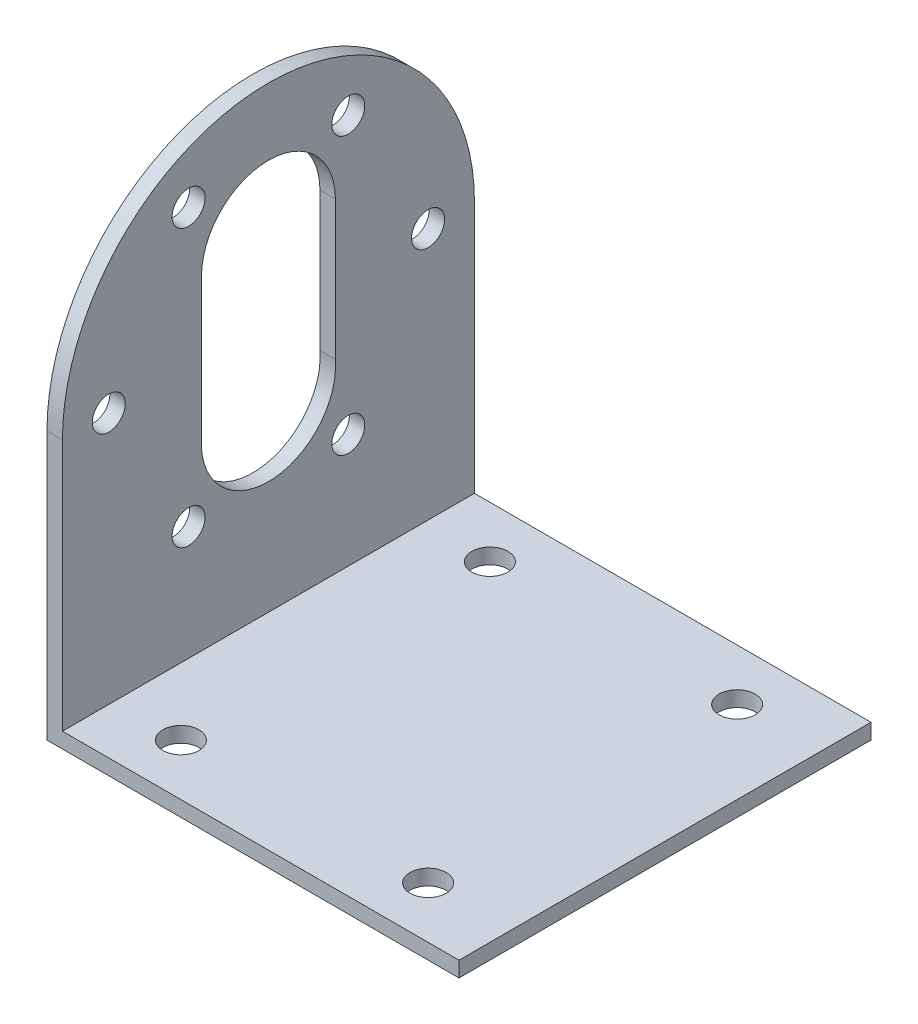
ISO-10303-21;
HEADER;
FILE_DESCRIPTION(('STEP AP214'),'2;1');
FILE_NAME('part.step','',(''),(''),'','','');
FILE_SCHEMA(('AUTOMOTIVE_DESIGN { 1 0 10303 214 1 1 1 1 }'));
ENDSEC;
DATA;
#1=APPLICATION_CONTEXT('core data for automotive mechanical design processes');
#2=APPLICATION_PROTOCOL_DEFINITION('international standard','automotive_design',2000,#1);
#3=PRODUCT_CONTEXT('',#1,'mechanical');
#4=PRODUCT('Part','Part','',(#3));
#5=PRODUCT_RELATED_PRODUCT_CATEGORY('part','',(#4));
#6=PRODUCT_DEFINITION_FORMATION('','',#4);
#7=PRODUCT_DEFINITION_CONTEXT('part definition',#1,'design');
#8=PRODUCT_DEFINITION('design','',#6,#7);
#9=PRODUCT_DEFINITION_SHAPE('','',#8);
#10=(LENGTH_UNIT() NAMED_UNIT(*) SI_UNIT(.MILLI.,.METRE.));
#11=(NAMED_UNIT(*) PLANE_ANGLE_UNIT() SI_UNIT($,.RADIAN.));
#12=(NAMED_UNIT(*) SI_UNIT($,.STERADIAN.) SOLID_ANGLE_UNIT());
#13=UNCERTAINTY_MEASURE_WITH_UNIT(LENGTH_MEASURE(1.E-05),#10,'distance_accuracy_value','');
#14=(GEOMETRIC_REPRESENTATION_CONTEXT(3) GLOBAL_UNCERTAINTY_ASSIGNED_CONTEXT((#13)) GLOBAL_UNIT_ASSIGNED_CONTEXT((#10,
#11,#12)) REPRESENTATION_CONTEXT('',''));
#15=CARTESIAN_POINT('',(0.,0.,0.));
#16=DIRECTION('',(0.,0.,1.));
#17=DIRECTION('',(1.,0.,0.));
#18=AXIS2_PLACEMENT_3D('',#15,#16,#17);
#19=CARTESIAN_POINT('',(20.,1.5,-20.));
#20=DIRECTION('',(-1.,0.,0.));
#21=DIRECTION('',(0.,0.,1.));
#22=AXIS2_PLACEMENT_3D('',#19,#20,#21);
#23=PLANE('',#22);
#24=DIRECTION('',(0.,0.,-1.));
#25=VECTOR('',#24,1.);
#26=CARTESIAN_POINT('',(20.,0.,-20.));
#27=LINE('',#26,#25);
#28=CARTESIAN_POINT('',(20.,0.,20.));
#29=VERTEX_POINT('',#28);
#30=CARTESIAN_POINT('',(20.,0.,-20.));
#31=VERTEX_POINT('',#30);
#32=EDGE_CURVE('E93',#29,#31,#27,.T.);
#33=ORIENTED_EDGE('',*,*,#32,.T.);
#34=DIRECTION('',(0.,-1.,0.));
#35=VECTOR('',#34,1.);
#36=CARTESIAN_POINT('',(20.,1.5,-20.));
#37=LINE('',#36,#35);
#38=CARTESIAN_POINT('',(20.,1.5,-20.));
#39=VERTEX_POINT('',#38);
#40=EDGE_CURVE('E11',#39,#31,#37,.T.);
#41=ORIENTED_EDGE('',*,*,#40,.F.);
#42=DIRECTION('',(0.,0.,-1.));
#43=VECTOR('',#42,1.);
#44=CARTESIAN_POINT('',(20.,1.5,-20.));
#45=LINE('',#44,#43);
#46=CARTESIAN_POINT('',(20.,1.5,20.));
#47=VERTEX_POINT('',#46);
#48=EDGE_CURVE('E87',#47,#39,#45,.T.);
#49=ORIENTED_EDGE('',*,*,#48,.F.);
#50=DIRECTION('',(0.,-1.,0.));
#51=VECTOR('',#50,1.);
#52=CARTESIAN_POINT('',(20.,1.5,20.));
#53=LINE('',#52,#51);
#54=EDGE_CURVE('E79',#47,#29,#53,.T.);
#55=ORIENTED_EDGE('',*,*,#54,.T.);
#56=EDGE_LOOP('',(#33,#41,#49,#55));
#57=FACE_BOUND('',#56,.T.);
#58=ADVANCED_FACE('F37',(#57),#23,.F.);
#59=CARTESIAN_POINT('',(-20.,1.5,-20.));
#60=DIRECTION('',(0.,0.,1.));
#61=DIRECTION('',(1.,0.,0.));
#62=AXIS2_PLACEMENT_3D('',#59,#60,#61);
#63=PLANE('',#62);
#64=DIRECTION('',(-1.,0.,0.));
#65=VECTOR('',#64,1.);
#66=CARTESIAN_POINT('',(-20.,0.,-20.));
#67=LINE('',#66,#65);
#68=CARTESIAN_POINT('',(-20.,0.,-20.));
#69=VERTEX_POINT('',#68);
#70=EDGE_CURVE('E96',#31,#69,#67,.T.);
#71=ORIENTED_EDGE('',*,*,#70,.T.);
#72=DIRECTION('',(0.,-1.,0.));
#73=VECTOR('',#72,1.);
#74=CARTESIAN_POINT('',(-20.,1.5,-20.));
#75=LINE('',#74,#73);
#76=CARTESIAN_POINT('',(-20.,26.,-20.));
#77=VERTEX_POINT('',#76);
#78=EDGE_CURVE('E44',#77,#69,#75,.T.);
#79=ORIENTED_EDGE('',*,*,#78,.F.);
#80=DIRECTION('',(-1.,0.,0.));
#81=VECTOR('',#80,1.);
#82=CARTESIAN_POINT('',(-18.5,26.,-20.));
#83=LINE('',#82,#81);
#84=CARTESIAN_POINT('',(-18.5,26.,-20.));
#85=VERTEX_POINT('',#84);
#86=EDGE_CURVE('E97',#85,#77,#83,.T.);
#87=ORIENTED_EDGE('',*,*,#86,.F.);
#88=DIRECTION('',(0.,-1.,0.));
#89=VECTOR('',#88,1.);
#90=CARTESIAN_POINT('',(-18.5,0.,-20.));
#91=LINE('',#90,#89);
#92=CARTESIAN_POINT('',(-18.5,1.5,-20.));
#93=VERTEX_POINT('',#92);
#94=EDGE_CURVE('E135',#85,#93,#91,.T.);
#95=ORIENTED_EDGE('',*,*,#94,.T.);
#96=DIRECTION('',(-1.,0.,0.));
#97=VECTOR('',#96,1.);
#98=CARTESIAN_POINT('',(-20.,1.5,-20.));
#99=LINE('',#98,#97);
#100=EDGE_CURVE('E190',#39,#93,#99,.T.);
#101=ORIENTED_EDGE('',*,*,#100,.F.);
#102=ORIENTED_EDGE('',*,*,#40,.T.);
#103=EDGE_LOOP('',(#71,#79,#87,#95,#101,#102));
#104=FACE_BOUND('',#103,.T.);
#105=ADVANCED_FACE('F118',(#104),#63,.F.);
#106=CARTESIAN_POINT('',(-20.,1.5,-20.));
#107=DIRECTION('',(1.,0.,0.));
#108=DIRECTION('',(0.,0.,-1.));
#109=AXIS2_PLACEMENT_3D('',#106,#107,#108);
#110=PLANE('',#109);
#111=DIRECTION('',(0.,0.,1.));
#112=VECTOR('',#111,1.);
#113=CARTESIAN_POINT('',(-20.,0.,-20.));
#114=LINE('',#113,#112);
#115=CARTESIAN_POINT('',(-20.,0.,20.));
#116=VERTEX_POINT('',#115);
#117=EDGE_CURVE('E88',#69,#116,#114,.T.);
#118=ORIENTED_EDGE('',*,*,#117,.T.);
#119=DIRECTION('',(0.,-1.,0.));
#120=VECTOR('',#119,1.);
#121=CARTESIAN_POINT('',(-20.,1.5,20.));
#122=LINE('',#121,#120);
#123=CARTESIAN_POINT('',(-20.,26.,20.));
#124=VERTEX_POINT('',#123);
#125=EDGE_CURVE('E83',#124,#116,#122,.T.);
#126=ORIENTED_EDGE('',*,*,#125,.F.);
#127=CARTESIAN_POINT('',(-20.,26.,0.));
#128=DIRECTION('',(-1.,0.,0.));
#129=DIRECTION('',(0.,0.,1.));
#130=AXIS2_PLACEMENT_3D('',#127,#128,#129);
#131=CIRCLE('',#130,20.);
#132=EDGE_CURVE('E115',#124,#77,#131,.T.);
#133=ORIENTED_EDGE('',*,*,#132,.T.);
#134=ORIENTED_EDGE('',*,*,#78,.T.);
#135=EDGE_LOOP('',(#118,#126,#133,#134));
#136=FACE_BOUND('',#135,.T.);
#137=CARTESIAN_POINT('',(-20.,19.,0.));
#138=DIRECTION('',(-1.,0.,0.));
#139=DIRECTION('',(0.,0.,1.));
#140=AXIS2_PLACEMENT_3D('',#137,#138,#139);
#141=CIRCLE('',#140,6.5214808463264);
#142=CARTESIAN_POINT('',(-20.,19.5288784633563,-6.49999999999999));
#143=VERTEX_POINT('',#142);
#144=CARTESIAN_POINT('',(-20.,19.5288784633563,6.5));
#145=VERTEX_POINT('',#144);
#146=EDGE_CURVE('E145',#143,#145,#141,.T.);
#147=ORIENTED_EDGE('',*,*,#146,.F.);
#148=DIRECTION('',(0.,-1.,0.));
#149=VECTOR('',#148,1.);
#150=CARTESIAN_POINT('',(-20.,0.,-6.49999999999999));
#151=LINE('',#150,#149);
#152=CARTESIAN_POINT('',(-20.,33.,-6.5));
#153=VERTEX_POINT('',#152);
#154=EDGE_CURVE('E148',#153,#143,#151,.T.);
#155=ORIENTED_EDGE('',*,*,#154,.F.);
#156=CARTESIAN_POINT('',(-20.,33.,0.));
#157=DIRECTION('',(-1.,0.,0.));
#158=DIRECTION('',(0.,0.,1.));
#159=AXIS2_PLACEMENT_3D('',#156,#157,#158);
#160=CIRCLE('',#159,6.5);
#161=CARTESIAN_POINT('',(-20.,33.,6.5));
#162=VERTEX_POINT('',#161);
#163=EDGE_CURVE('E152',#162,#153,#160,.T.);
#164=ORIENTED_EDGE('',*,*,#163,.F.);
#165=DIRECTION('',(0.,-1.,0.));
#166=VECTOR('',#165,1.);
#167=CARTESIAN_POINT('',(-20.,0.,6.5));
#168=LINE('',#167,#166);
#169=EDGE_CURVE('E155',#162,#145,#168,.T.);
#170=ORIENTED_EDGE('',*,*,#169,.T.);
#171=EDGE_LOOP('',(#147,#155,#164,#170));
#172=FACE_BOUND('',#171,.T.);
#173=CARTESIAN_POINT('',(-20.,39.4233937586587,7.75000000000016));
#174=DIRECTION('',(-1.,0.,0.));
#175=DIRECTION('',(0.,0.,1.));
#176=AXIS2_PLACEMENT_3D('',#173,#174,#175);
#177=CIRCLE('',#176,1.6);
#178=CARTESIAN_POINT('',(-20.,39.4233937586587,9.35000000000015));
#179=VERTEX_POINT('',#178);
#180=EDGE_CURVE('E158',#179,#179,#177,.T.);
#181=ORIENTED_EDGE('',*,*,#180,.F.);
#182=EDGE_LOOP('',(#181));
#183=FACE_BOUND('',#182,.T.);
#184=CARTESIAN_POINT('',(-20.,39.4233937586589,-7.74999999999987));
#185=DIRECTION('',(-1.,0.,0.));
#186=DIRECTION('',(0.,0.,1.));
#187=AXIS2_PLACEMENT_3D('',#184,#185,#186);
#188=CIRCLE('',#187,1.6);
#189=CARTESIAN_POINT('',(-20.,39.4233937586589,-6.14999999999986));
#190=VERTEX_POINT('',#189);
#191=EDGE_CURVE('E161',#190,#190,#188,.T.);
#192=ORIENTED_EDGE('',*,*,#191,.F.);
#193=EDGE_LOOP('',(#192));
#194=FACE_BOUND('',#193,.T.);
#195=CARTESIAN_POINT('',(-20.,26.0000000000001,-15.5));
#196=DIRECTION('',(-1.,0.,0.));
#197=DIRECTION('',(0.,0.,1.));
#198=AXIS2_PLACEMENT_3D('',#195,#196,#197);
#199=CIRCLE('',#198,1.6);
#200=CARTESIAN_POINT('',(-20.,26.0000000000001,-13.9));
#201=VERTEX_POINT('',#200);
#202=EDGE_CURVE('E164',#201,#201,#199,.T.);
#203=ORIENTED_EDGE('',*,*,#202,.F.);
#204=EDGE_LOOP('',(#203));
#205=FACE_BOUND('',#204,.T.);
#206=CARTESIAN_POINT('',(-20.,12.5766062413412,-7.75000000000006));
#207=DIRECTION('',(-1.,0.,0.));
#208=DIRECTION('',(0.,0.,1.));
#209=AXIS2_PLACEMENT_3D('',#206,#207,#208);
#210=CIRCLE('',#209,1.6);
#211=CARTESIAN_POINT('',(-20.,12.5766062413412,-6.15000000000006));
#212=VERTEX_POINT('',#211);
#213=EDGE_CURVE('E167',#212,#212,#210,.T.);
#214=ORIENTED_EDGE('',*,*,#213,.F.);
#215=EDGE_LOOP('',(#214));
#216=FACE_BOUND('',#215,.T.);
#217=CARTESIAN_POINT('',(-20.,12.5766062413412,7.74999999999997));
#218=DIRECTION('',(-1.,0.,0.));
#219=DIRECTION('',(0.,0.,1.));
#220=AXIS2_PLACEMENT_3D('',#217,#218,#219);
#221=CIRCLE('',#220,1.6);
#222=CARTESIAN_POINT('',(-20.,12.5766062413412,9.34999999999997));
#223=VERTEX_POINT('',#222);
#224=EDGE_CURVE('E170',#223,#223,#221,.T.);
#225=ORIENTED_EDGE('',*,*,#224,.F.);
#226=EDGE_LOOP('',(#225));
#227=FACE_BOUND('',#226,.T.);
#228=CARTESIAN_POINT('',(-20.,26.,15.5));
#229=DIRECTION('',(-1.,0.,0.));
#230=DIRECTION('',(0.,0.,1.));
#231=AXIS2_PLACEMENT_3D('',#228,#229,#230);
#232=CIRCLE('',#231,1.6);
#233=CARTESIAN_POINT('',(-20.,26.,17.1));
#234=VERTEX_POINT('',#233);
#235=EDGE_CURVE('E173',#234,#234,#232,.T.);
#236=ORIENTED_EDGE('',*,*,#235,.F.);
#237=EDGE_LOOP('',(#236));
#238=FACE_BOUND('',#237,.T.);
#239=ADVANCED_FACE('F111',(#136,#172,#183,#194,#205,#216,#227,#238),#110,.F.);
#240=CARTESIAN_POINT('',(-20.,1.5,20.));
#241=DIRECTION('',(0.,0.,-1.));
#242=DIRECTION('',(-1.,0.,0.));
#243=AXIS2_PLACEMENT_3D('',#240,#241,#242);
#244=PLANE('',#243);
#245=DIRECTION('',(1.,0.,0.));
#246=VECTOR('',#245,1.);
#247=CARTESIAN_POINT('',(-20.,0.,20.));
#248=LINE('',#247,#246);
#249=EDGE_CURVE('E76',#116,#29,#248,.T.);
#250=ORIENTED_EDGE('',*,*,#249,.T.);
#251=ORIENTED_EDGE('',*,*,#54,.F.);
#252=DIRECTION('',(1.,0.,0.));
#253=VECTOR('',#252,1.);
#254=CARTESIAN_POINT('',(-20.,1.5,20.));
#255=LINE('',#254,#253);
#256=CARTESIAN_POINT('',(-18.5,1.5,20.));
#257=VERTEX_POINT('',#256);
#258=EDGE_CURVE('E56',#257,#47,#255,.T.);
#259=ORIENTED_EDGE('',*,*,#258,.F.);
#260=DIRECTION('',(0.,1.,0.));
#261=VECTOR('',#260,1.);
#262=CARTESIAN_POINT('',(-18.5,0.,20.));
#263=LINE('',#262,#261);
#264=CARTESIAN_POINT('',(-18.5,26.,20.));
#265=VERTEX_POINT('',#264);
#266=EDGE_CURVE('E136',#257,#265,#263,.T.);
#267=ORIENTED_EDGE('',*,*,#266,.T.);
#268=DIRECTION('',(-1.,0.,0.));
#269=VECTOR('',#268,1.);
#270=CARTESIAN_POINT('',(-18.5,26.,20.));
#271=LINE('',#270,#269);
#272=EDGE_CURVE('E101',#265,#124,#271,.T.);
#273=ORIENTED_EDGE('',*,*,#272,.T.);
#274=ORIENTED_EDGE('',*,*,#125,.T.);
#275=EDGE_LOOP('',(#250,#251,#259,#267,#273,#274));
#276=FACE_BOUND('',#275,.T.);
#277=ADVANCED_FACE('F78',(#276),#244,.F.);
#278=CARTESIAN_POINT('',(0.,1.5,0.));
#279=DIRECTION('',(0.,1.,0.));
#280=DIRECTION('',(0.,0.,1.));
#281=AXIS2_PLACEMENT_3D('',#278,#279,#280);
#282=PLANE('',#281);
#283=CARTESIAN_POINT('',(12.,1.5,-15.));
#284=DIRECTION('',(0.,1.,0.));
#285=DIRECTION('',(0.,0.,-1.));
#286=AXIS2_PLACEMENT_3D('',#283,#284,#285);
#287=CIRCLE('',#286,1.75);
#288=CARTESIAN_POINT('',(12.,1.5,-16.75));
#289=VERTEX_POINT('',#288);
#290=EDGE_CURVE('E468',#289,#289,#287,.T.);
#291=ORIENTED_EDGE('',*,*,#290,.F.);
#292=EDGE_LOOP('',(#291));
#293=FACE_BOUND('',#292,.T.);
#294=CARTESIAN_POINT('',(-12.,1.5,15.));
#295=DIRECTION('',(0.,1.,0.));
#296=DIRECTION('',(0.,0.,-1.));
#297=AXIS2_PLACEMENT_3D('',#294,#295,#296);
#298=CIRCLE('',#297,1.75);
#299=CARTESIAN_POINT('',(-12.,1.5,13.25));
#300=VERTEX_POINT('',#299);
#301=EDGE_CURVE('E474',#300,#300,#298,.T.);
#302=ORIENTED_EDGE('',*,*,#301,.F.);
#303=EDGE_LOOP('',(#302));
#304=FACE_BOUND('',#303,.T.);
#305=CARTESIAN_POINT('',(-12.,1.5,-15.));
#306=DIRECTION('',(0.,1.,0.));
#307=DIRECTION('',(0.,0.,1.));
#308=AXIS2_PLACEMENT_3D('',#305,#306,#307);
#309=CIRCLE('',#308,1.75);
#310=CARTESIAN_POINT('',(-12.,1.5,-13.25));
#311=VERTEX_POINT('',#310);
#312=EDGE_CURVE('E482',#311,#311,#309,.T.);
#313=ORIENTED_EDGE('',*,*,#312,.F.);
#314=EDGE_LOOP('',(#313));
#315=FACE_BOUND('',#314,.T.);
#316=CARTESIAN_POINT('',(12.,1.5,15.));
#317=DIRECTION('',(0.,1.,0.));
#318=DIRECTION('',(0.,0.,1.));
#319=AXIS2_PLACEMENT_3D('',#316,#317,#318);
#320=CIRCLE('',#319,1.75);
#321=CARTESIAN_POINT('',(12.,1.5,16.75));
#322=VERTEX_POINT('',#321);
#323=EDGE_CURVE('E471',#322,#322,#320,.T.);
#324=ORIENTED_EDGE('',*,*,#323,.F.);
#325=EDGE_LOOP('',(#324));
#326=FACE_BOUND('',#325,.T.);
#327=DIRECTION('',(0.,0.,-1.));
#328=VECTOR('',#327,1.);
#329=CARTESIAN_POINT('',(-18.5,1.5,0.));
#330=LINE('',#329,#328);
#331=EDGE_CURVE('E51',#257,#93,#330,.T.);
#332=ORIENTED_EDGE('',*,*,#331,.F.);
#333=ORIENTED_EDGE('',*,*,#258,.T.);
#334=ORIENTED_EDGE('',*,*,#48,.T.);
#335=ORIENTED_EDGE('',*,*,#100,.T.);
#336=EDGE_LOOP('',(#332,#333,#334,#335));
#337=FACE_BOUND('',#336,.T.);
#338=ADVANCED_FACE('F191',(#293,#304,#315,#326,#337),#282,.T.);
#339=CARTESIAN_POINT('',(0.,0.,0.));
#340=DIRECTION('',(0.,1.,0.));
#341=DIRECTION('',(0.,0.,1.));
#342=AXIS2_PLACEMENT_3D('',#339,#340,#341);
#343=PLANE('',#342);
#344=CARTESIAN_POINT('',(12.,0.,-15.));
#345=DIRECTION('',(0.,1.,0.));
#346=DIRECTION('',(0.,0.,-1.));
#347=AXIS2_PLACEMENT_3D('',#344,#345,#346);
#348=CIRCLE('',#347,1.75);
#349=CARTESIAN_POINT('',(12.,0.,-16.75));
#350=VERTEX_POINT('',#349);
#351=EDGE_CURVE('E465',#350,#350,#348,.T.);
#352=ORIENTED_EDGE('',*,*,#351,.T.);
#353=EDGE_LOOP('',(#352));
#354=FACE_BOUND('',#353,.T.);
#355=CARTESIAN_POINT('',(-12.,0.,15.));
#356=DIRECTION('',(0.,1.,0.));
#357=DIRECTION('',(0.,0.,-1.));
#358=AXIS2_PLACEMENT_3D('',#355,#356,#357);
#359=CIRCLE('',#358,1.75);
#360=CARTESIAN_POINT('',(-12.,0.,13.25));
#361=VERTEX_POINT('',#360);
#362=EDGE_CURVE('E469',#361,#361,#359,.T.);
#363=ORIENTED_EDGE('',*,*,#362,.T.);
#364=EDGE_LOOP('',(#363));
#365=FACE_BOUND('',#364,.T.);
#366=CARTESIAN_POINT('',(-12.,0.,-15.));
#367=DIRECTION('',(0.,1.,0.));
#368=DIRECTION('',(0.,0.,1.));
#369=AXIS2_PLACEMENT_3D('',#366,#367,#368);
#370=CIRCLE('',#369,1.75);
#371=CARTESIAN_POINT('',(-12.,0.,-13.25));
#372=VERTEX_POINT('',#371);
#373=EDGE_CURVE('E479',#372,#372,#370,.T.);
#374=ORIENTED_EDGE('',*,*,#373,.T.);
#375=EDGE_LOOP('',(#374));
#376=FACE_BOUND('',#375,.T.);
#377=CARTESIAN_POINT('',(12.,0.,15.));
#378=DIRECTION('',(0.,1.,0.));
#379=DIRECTION('',(0.,0.,1.));
#380=AXIS2_PLACEMENT_3D('',#377,#378,#379);
#381=CIRCLE('',#380,1.75);
#382=CARTESIAN_POINT('',(12.,0.,16.75));
#383=VERTEX_POINT('',#382);
#384=EDGE_CURVE('E149',#383,#383,#381,.T.);
#385=ORIENTED_EDGE('',*,*,#384,.T.);
#386=EDGE_LOOP('',(#385));
#387=FACE_BOUND('',#386,.T.);
#388=ORIENTED_EDGE('',*,*,#32,.F.);
#389=ORIENTED_EDGE('',*,*,#249,.F.);
#390=ORIENTED_EDGE('',*,*,#117,.F.);
#391=ORIENTED_EDGE('',*,*,#70,.F.);
#392=EDGE_LOOP('',(#388,#389,#390,#391));
#393=FACE_BOUND('',#392,.T.);
#394=ADVANCED_FACE('F95',(#354,#365,#376,#387,#393),#343,.F.);
#395=CARTESIAN_POINT('',(-18.5,19.,0.));
#396=DIRECTION('',(-1.,0.,0.));
#397=DIRECTION('',(0.,0.,1.));
#398=AXIS2_PLACEMENT_3D('',#395,#396,#397);
#399=CYLINDRICAL_SURFACE('',#398,6.5214808463264);
#400=ORIENTED_EDGE('',*,*,#146,.T.);
#401=DIRECTION('',(-1.,0.,0.));
#402=VECTOR('',#401,1.);
#403=CARTESIAN_POINT('',(-18.5,19.5288784633563,6.5));
#404=LINE('',#403,#402);
#405=CARTESIAN_POINT('',(-18.5,19.5288784633563,6.5));
#406=VERTEX_POINT('',#405);
#407=EDGE_CURVE('E179',#406,#145,#404,.T.);
#408=ORIENTED_EDGE('',*,*,#407,.F.);
#409=CARTESIAN_POINT('',(-18.5,19.,0.));
#410=DIRECTION('',(-1.,0.,0.));
#411=DIRECTION('',(0.,0.,1.));
#412=AXIS2_PLACEMENT_3D('',#409,#410,#411);
#413=CIRCLE('',#412,6.5214808463264);
#414=CARTESIAN_POINT('',(-18.5,19.5288784633563,-6.49999999999999));
#415=VERTEX_POINT('',#414);
#416=EDGE_CURVE('E176',#415,#406,#413,.T.);
#417=ORIENTED_EDGE('',*,*,#416,.F.);
#418=DIRECTION('',(-1.,0.,0.));
#419=VECTOR('',#418,1.);
#420=CARTESIAN_POINT('',(-18.5,19.5288784633563,-6.49999999999999));
#421=LINE('',#420,#419);
#422=EDGE_CURVE('E144',#415,#143,#421,.T.);
#423=ORIENTED_EDGE('',*,*,#422,.T.);
#424=EDGE_LOOP('',(#400,#408,#417,#423));
#425=FACE_BOUND('',#424,.T.);
#426=ADVANCED_FACE('F220',(#425),#399,.F.);
#427=CARTESIAN_POINT('',(-18.5,0.,6.5));
#428=DIRECTION('',(0.,0.,-1.));
#429=DIRECTION('',(-1.,0.,0.));
#430=AXIS2_PLACEMENT_3D('',#427,#428,#429);
#431=PLANE('',#430);
#432=ORIENTED_EDGE('',*,*,#169,.F.);
#433=DIRECTION('',(-1.,0.,0.));
#434=VECTOR('',#433,1.);
#435=CARTESIAN_POINT('',(-18.5,33.,6.5));
#436=LINE('',#435,#434);
#437=CARTESIAN_POINT('',(-18.5,33.,6.5));
#438=VERTEX_POINT('',#437);
#439=EDGE_CURVE('E182',#438,#162,#436,.T.);
#440=ORIENTED_EDGE('',*,*,#439,.F.);
#441=DIRECTION('',(0.,-1.,0.));
#442=VECTOR('',#441,1.);
#443=CARTESIAN_POINT('',(-18.5,0.,6.5));
#444=LINE('',#443,#442);
#445=EDGE_CURVE('E216',#438,#406,#444,.T.);
#446=ORIENTED_EDGE('',*,*,#445,.T.);
#447=ORIENTED_EDGE('',*,*,#407,.T.);
#448=EDGE_LOOP('',(#432,#440,#446,#447));
#449=FACE_BOUND('',#448,.T.);
#450=ADVANCED_FACE('F213',(#449),#431,.T.);
#451=CARTESIAN_POINT('',(-18.5,33.,0.));
#452=DIRECTION('',(-1.,0.,0.));
#453=DIRECTION('',(0.,0.,1.));
#454=AXIS2_PLACEMENT_3D('',#451,#452,#453);
#455=CYLINDRICAL_SURFACE('',#454,6.5);
#456=ORIENTED_EDGE('',*,*,#163,.T.);
#457=DIRECTION('',(-1.,0.,0.));
#458=VECTOR('',#457,1.);
#459=CARTESIAN_POINT('',(-18.5,33.,-6.5));
#460=LINE('',#459,#458);
#461=CARTESIAN_POINT('',(-18.5,33.,-6.5));
#462=VERTEX_POINT('',#461);
#463=EDGE_CURVE('E185',#462,#153,#460,.T.);
#464=ORIENTED_EDGE('',*,*,#463,.F.);
#465=CARTESIAN_POINT('',(-18.5,33.,0.));
#466=DIRECTION('',(-1.,0.,0.));
#467=DIRECTION('',(0.,0.,1.));
#468=AXIS2_PLACEMENT_3D('',#465,#466,#467);
#469=CIRCLE('',#468,6.5);
#470=EDGE_CURVE('E238',#438,#462,#469,.T.);
#471=ORIENTED_EDGE('',*,*,#470,.F.);
#472=ORIENTED_EDGE('',*,*,#439,.T.);
#473=EDGE_LOOP('',(#456,#464,#471,#472));
#474=FACE_BOUND('',#473,.T.);
#475=ADVANCED_FACE('F227',(#474),#455,.F.);
#476=CARTESIAN_POINT('',(-18.5,26.,15.5));
#477=DIRECTION('',(-1.,0.,0.));
#478=DIRECTION('',(0.,0.,1.));
#479=AXIS2_PLACEMENT_3D('',#476,#477,#478);
#480=CYLINDRICAL_SURFACE('',#479,1.6);
#481=CARTESIAN_POINT('',(-18.5,26.,15.5));
#482=DIRECTION('',(-1.,0.,0.));
#483=DIRECTION('',(0.,0.,1.));
#484=AXIS2_PLACEMENT_3D('',#481,#482,#483);
#485=CIRCLE('',#484,1.6);
#486=CARTESIAN_POINT('',(-18.5,26.,17.1));
#487=VERTEX_POINT('',#486);
#488=EDGE_CURVE('E139',#487,#487,#485,.T.);
#489=ORIENTED_EDGE('',*,*,#488,.F.);
#490=EDGE_LOOP('',(#489));
#491=FACE_BOUND('',#490,.T.);
#492=ORIENTED_EDGE('',*,*,#235,.T.);
#493=EDGE_LOOP('',(#492));
#494=FACE_BOUND('',#493,.T.);
#495=ADVANCED_FACE('F263',(#491,#494),#480,.F.);
#496=CARTESIAN_POINT('',(-18.5,12.5766062413412,7.74999999999997));
#497=DIRECTION('',(-1.,0.,0.));
#498=DIRECTION('',(0.,0.,1.));
#499=AXIS2_PLACEMENT_3D('',#496,#497,#498);
#500=CYLINDRICAL_SURFACE('',#499,1.6);
#501=CARTESIAN_POINT('',(-18.5,12.5766062413412,7.74999999999997));
#502=DIRECTION('',(-1.,0.,0.));
#503=DIRECTION('',(0.,0.,1.));
#504=AXIS2_PLACEMENT_3D('',#501,#502,#503);
#505=CIRCLE('',#504,1.6);
#506=CARTESIAN_POINT('',(-18.5,12.5766062413412,9.34999999999997));
#507=VERTEX_POINT('',#506);
#508=EDGE_CURVE('E257',#507,#507,#505,.T.);
#509=ORIENTED_EDGE('',*,*,#508,.F.);
#510=EDGE_LOOP('',(#509));
#511=FACE_BOUND('',#510,.T.);
#512=ORIENTED_EDGE('',*,*,#224,.T.);
#513=EDGE_LOOP('',(#512));
#514=FACE_BOUND('',#513,.T.);
#515=ADVANCED_FACE('F266',(#511,#514),#500,.F.);
#516=CARTESIAN_POINT('',(-18.5,12.5766062413412,-7.75000000000006));
#517=DIRECTION('',(-1.,0.,0.));
#518=DIRECTION('',(0.,0.,1.));
#519=AXIS2_PLACEMENT_3D('',#516,#517,#518);
#520=CYLINDRICAL_SURFACE('',#519,1.6);
#521=CARTESIAN_POINT('',(-18.5,12.5766062413412,-7.75000000000006));
#522=DIRECTION('',(-1.,0.,0.));
#523=DIRECTION('',(0.,0.,1.));
#524=AXIS2_PLACEMENT_3D('',#521,#522,#523);
#525=CIRCLE('',#524,1.6);
#526=CARTESIAN_POINT('',(-18.5,12.5766062413412,-6.15000000000006));
#527=VERTEX_POINT('',#526);
#528=EDGE_CURVE('E254',#527,#527,#525,.T.);
#529=ORIENTED_EDGE('',*,*,#528,.F.);
#530=EDGE_LOOP('',(#529));
#531=FACE_BOUND('',#530,.T.);
#532=ORIENTED_EDGE('',*,*,#213,.T.);
#533=EDGE_LOOP('',(#532));
#534=FACE_BOUND('',#533,.T.);
#535=ADVANCED_FACE('F339',(#531,#534),#520,.F.);
#536=CARTESIAN_POINT('',(-18.5,26.0000000000001,-15.5));
#537=DIRECTION('',(-1.,0.,0.));
#538=DIRECTION('',(0.,0.,1.));
#539=AXIS2_PLACEMENT_3D('',#536,#537,#538);
#540=CYLINDRICAL_SURFACE('',#539,1.6);
#541=CARTESIAN_POINT('',(-18.5,26.0000000000001,-15.5));
#542=DIRECTION('',(-1.,0.,0.));
#543=DIRECTION('',(0.,0.,1.));
#544=AXIS2_PLACEMENT_3D('',#541,#542,#543);
#545=CIRCLE('',#544,1.6);
#546=CARTESIAN_POINT('',(-18.5,26.0000000000001,-13.9));
#547=VERTEX_POINT('',#546);
#548=EDGE_CURVE('E251',#547,#547,#545,.T.);
#549=ORIENTED_EDGE('',*,*,#548,.F.);
#550=EDGE_LOOP('',(#549));
#551=FACE_BOUND('',#550,.T.);
#552=ORIENTED_EDGE('',*,*,#202,.T.);
#553=EDGE_LOOP('',(#552));
#554=FACE_BOUND('',#553,.T.);
#555=ADVANCED_FACE('F349',(#551,#554),#540,.F.);
#556=CARTESIAN_POINT('',(-18.5,39.4233937586589,-7.74999999999987));
#557=DIRECTION('',(-1.,0.,0.));
#558=DIRECTION('',(0.,0.,1.));
#559=AXIS2_PLACEMENT_3D('',#556,#557,#558);
#560=CYLINDRICAL_SURFACE('',#559,1.6);
#561=CARTESIAN_POINT('',(-18.5,39.4233937586589,-7.74999999999987));
#562=DIRECTION('',(-1.,0.,0.));
#563=DIRECTION('',(0.,0.,1.));
#564=AXIS2_PLACEMENT_3D('',#561,#562,#563);
#565=CIRCLE('',#564,1.6);
#566=CARTESIAN_POINT('',(-18.5,39.4233937586589,-6.14999999999986));
#567=VERTEX_POINT('',#566);
#568=EDGE_CURVE('E248',#567,#567,#565,.T.);
#569=ORIENTED_EDGE('',*,*,#568,.F.);
#570=EDGE_LOOP('',(#569));
#571=FACE_BOUND('',#570,.T.);
#572=ORIENTED_EDGE('',*,*,#191,.T.);
#573=EDGE_LOOP('',(#572));
#574=FACE_BOUND('',#573,.T.);
#575=ADVANCED_FACE('F359',(#571,#574),#560,.F.);
#576=CARTESIAN_POINT('',(-18.5,39.4233937586587,7.75000000000016));
#577=DIRECTION('',(-1.,0.,0.));
#578=DIRECTION('',(0.,0.,1.));
#579=AXIS2_PLACEMENT_3D('',#576,#577,#578);
#580=CYLINDRICAL_SURFACE('',#579,1.6);
#581=CARTESIAN_POINT('',(-18.5,39.4233937586587,7.75000000000016));
#582=DIRECTION('',(-1.,0.,0.));
#583=DIRECTION('',(0.,0.,1.));
#584=AXIS2_PLACEMENT_3D('',#581,#582,#583);
#585=CIRCLE('',#584,1.6);
#586=CARTESIAN_POINT('',(-18.5,39.4233937586587,9.35000000000015));
#587=VERTEX_POINT('',#586);
#588=EDGE_CURVE('E245',#587,#587,#585,.T.);
#589=ORIENTED_EDGE('',*,*,#588,.F.);
#590=EDGE_LOOP('',(#589));
#591=FACE_BOUND('',#590,.T.);
#592=ORIENTED_EDGE('',*,*,#180,.T.);
#593=EDGE_LOOP('',(#592));
#594=FACE_BOUND('',#593,.T.);
#595=ADVANCED_FACE('F369',(#591,#594),#580,.F.);
#596=CARTESIAN_POINT('',(-18.5,0.,-6.49999999999999));
#597=DIRECTION('',(0.,0.,-1.));
#598=DIRECTION('',(-1.,0.,0.));
#599=AXIS2_PLACEMENT_3D('',#596,#597,#598);
#600=PLANE('',#599);
#601=ORIENTED_EDGE('',*,*,#154,.T.);
#602=ORIENTED_EDGE('',*,*,#422,.F.);
#603=DIRECTION('',(0.,-1.,0.));
#604=VECTOR('',#603,1.);
#605=CARTESIAN_POINT('',(-18.5,0.,-6.49999999999999));
#606=LINE('',#605,#604);
#607=EDGE_CURVE('E234',#462,#415,#606,.T.);
#608=ORIENTED_EDGE('',*,*,#607,.F.);
#609=ORIENTED_EDGE('',*,*,#463,.T.);
#610=EDGE_LOOP('',(#601,#602,#608,#609));
#611=FACE_BOUND('',#610,.T.);
#612=ADVANCED_FACE('F232',(#611),#600,.F.);
#613=CARTESIAN_POINT('',(-18.5,26.,0.));
#614=DIRECTION('',(-1.,0.,0.));
#615=DIRECTION('',(0.,0.,1.));
#616=AXIS2_PLACEMENT_3D('',#613,#614,#615);
#617=CYLINDRICAL_SURFACE('',#616,20.);
#618=ORIENTED_EDGE('',*,*,#132,.F.);
#619=ORIENTED_EDGE('',*,*,#272,.F.);
#620=CARTESIAN_POINT('',(-18.5,26.,0.));
#621=DIRECTION('',(-1.,0.,0.));
#622=DIRECTION('',(0.,0.,1.));
#623=AXIS2_PLACEMENT_3D('',#620,#621,#622);
#624=CIRCLE('',#623,20.);
#625=EDGE_CURVE('E129',#265,#85,#624,.T.);
#626=ORIENTED_EDGE('',*,*,#625,.T.);
#627=ORIENTED_EDGE('',*,*,#86,.T.);
#628=EDGE_LOOP('',(#618,#619,#626,#627));
#629=FACE_BOUND('',#628,.T.);
#630=ADVANCED_FACE('F126',(#629),#617,.T.);
#631=CARTESIAN_POINT('',(-18.5,0.,0.));
#632=DIRECTION('',(-1.,0.,0.));
#633=DIRECTION('',(0.,0.,1.));
#634=AXIS2_PLACEMENT_3D('',#631,#632,#633);
#635=PLANE('',#634);
#636=ORIENTED_EDGE('',*,*,#416,.T.);
#637=ORIENTED_EDGE('',*,*,#445,.F.);
#638=ORIENTED_EDGE('',*,*,#470,.T.);
#639=ORIENTED_EDGE('',*,*,#607,.T.);
#640=EDGE_LOOP('',(#636,#637,#638,#639));
#641=FACE_BOUND('',#640,.T.);
#642=ORIENTED_EDGE('',*,*,#588,.T.);
#643=EDGE_LOOP('',(#642));
#644=FACE_BOUND('',#643,.T.);
#645=ORIENTED_EDGE('',*,*,#568,.T.);
#646=EDGE_LOOP('',(#645));
#647=FACE_BOUND('',#646,.T.);
#648=ORIENTED_EDGE('',*,*,#548,.T.);
#649=EDGE_LOOP('',(#648));
#650=FACE_BOUND('',#649,.T.);
#651=ORIENTED_EDGE('',*,*,#528,.T.);
#652=EDGE_LOOP('',(#651));
#653=FACE_BOUND('',#652,.T.);
#654=ORIENTED_EDGE('',*,*,#508,.T.);
#655=EDGE_LOOP('',(#654));
#656=FACE_BOUND('',#655,.T.);
#657=ORIENTED_EDGE('',*,*,#488,.T.);
#658=EDGE_LOOP('',(#657));
#659=FACE_BOUND('',#658,.T.);
#660=ORIENTED_EDGE('',*,*,#266,.F.);
#661=ORIENTED_EDGE('',*,*,#331,.T.);
#662=ORIENTED_EDGE('',*,*,#94,.F.);
#663=ORIENTED_EDGE('',*,*,#625,.F.);
#664=EDGE_LOOP('',(#660,#661,#662,#663));
#665=FACE_BOUND('',#664,.T.);
#666=ADVANCED_FACE('F193',(#641,#644,#647,#650,#653,#656,#659,#665),#635,.F.);
#667=CARTESIAN_POINT('',(12.,0.,15.));
#668=DIRECTION('',(0.,1.,0.));
#669=DIRECTION('',(0.,0.,1.));
#670=AXIS2_PLACEMENT_3D('',#667,#668,#669);
#671=CYLINDRICAL_SURFACE('',#670,1.75);
#672=ORIENTED_EDGE('',*,*,#384,.F.);
#673=EDGE_LOOP('',(#672));
#674=FACE_BOUND('',#673,.T.);
#675=ORIENTED_EDGE('',*,*,#323,.T.);
#676=EDGE_LOOP('',(#675));
#677=FACE_BOUND('',#676,.T.);
#678=ADVANCED_FACE('F404',(#674,#677),#671,.F.);
#679=CARTESIAN_POINT('',(-12.,0.,-15.));
#680=DIRECTION('',(0.,1.,0.));
#681=DIRECTION('',(0.,0.,1.));
#682=AXIS2_PLACEMENT_3D('',#679,#680,#681);
#683=CYLINDRICAL_SURFACE('',#682,1.75);
#684=ORIENTED_EDGE('',*,*,#373,.F.);
#685=EDGE_LOOP('',(#684));
#686=FACE_BOUND('',#685,.T.);
#687=ORIENTED_EDGE('',*,*,#312,.T.);
#688=EDGE_LOOP('',(#687));
#689=FACE_BOUND('',#688,.T.);
#690=ADVANCED_FACE('F428',(#686,#689),#683,.F.);
#691=CARTESIAN_POINT('',(-12.,0.,15.));
#692=DIRECTION('',(0.,1.,0.));
#693=DIRECTION('',(0.,0.,1.));
#694=AXIS2_PLACEMENT_3D('',#691,#692,#693);
#695=CYLINDRICAL_SURFACE('',#694,1.75);
#696=ORIENTED_EDGE('',*,*,#362,.F.);
#697=EDGE_LOOP('',(#696));
#698=FACE_BOUND('',#697,.T.);
#699=ORIENTED_EDGE('',*,*,#301,.T.);
#700=EDGE_LOOP('',(#699));
#701=FACE_BOUND('',#700,.T.);
#702=ADVANCED_FACE('F438',(#698,#701),#695,.F.);
#703=CARTESIAN_POINT('',(12.,0.,-15.));
#704=DIRECTION('',(0.,1.,0.));
#705=DIRECTION('',(0.,0.,1.));
#706=AXIS2_PLACEMENT_3D('',#703,#704,#705);
#707=CYLINDRICAL_SURFACE('',#706,1.75);
#708=ORIENTED_EDGE('',*,*,#351,.F.);
#709=EDGE_LOOP('',(#708));
#710=FACE_BOUND('',#709,.T.);
#711=ORIENTED_EDGE('',*,*,#290,.T.);
#712=EDGE_LOOP('',(#711));
#713=FACE_BOUND('',#712,.T.);
#714=ADVANCED_FACE('F448',(#710,#713),#707,.F.);
#715=CLOSED_SHELL('',(#58,#105,#239,#277,#338,#394,#426,#450,#475,#495,#515,#535,#555,#575,#595,
#612,#630,#666,#678,#690,#702,#714));
#716=MANIFOLD_SOLID_BREP('B2',#715);
#717=ADVANCED_BREP_SHAPE_REPRESENTATION('',(#18,#716),#14);
#718=SHAPE_DEFINITION_REPRESENTATION(#9,#717);
ENDSEC;
END-ISO-10303-21;
